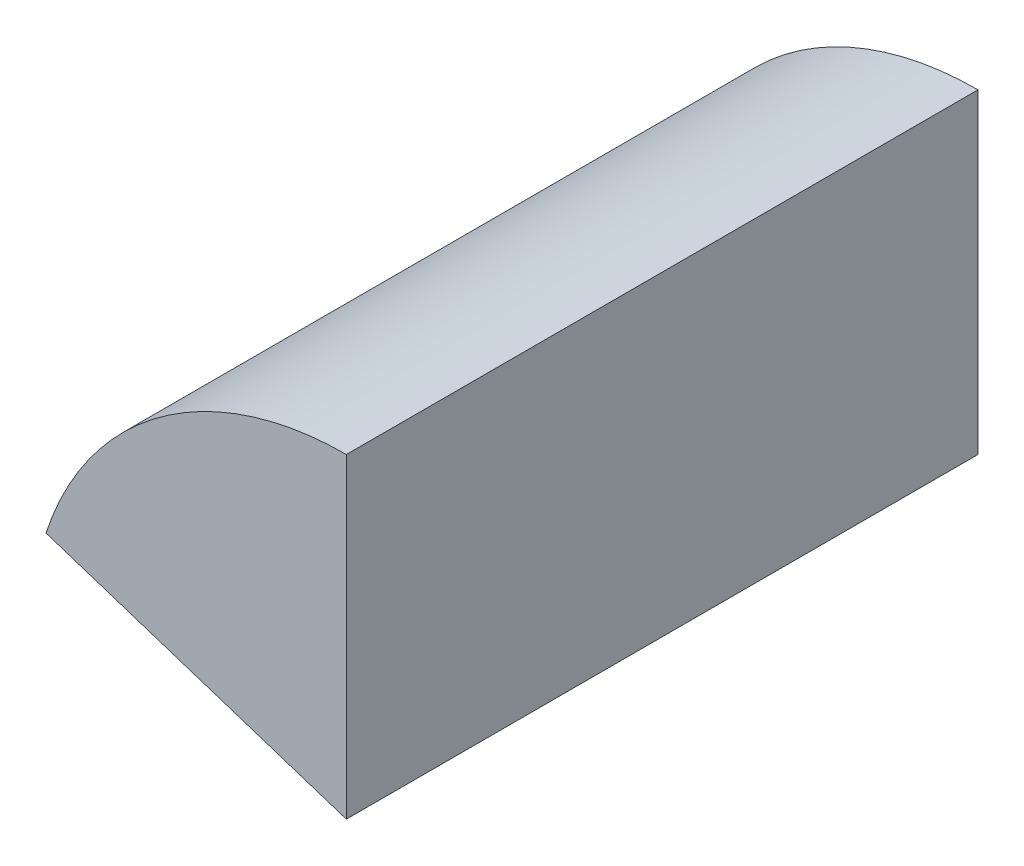
ISO-10303-21;
HEADER;
FILE_DESCRIPTION(('STEP AP214'),'2;1');
FILE_NAME('part.step','',(''),(''),'','','');
FILE_SCHEMA(('AUTOMOTIVE_DESIGN { 1 0 10303 214 1 1 1 1 }'));
ENDSEC;
DATA;
#1=APPLICATION_CONTEXT('core data for automotive mechanical design processes');
#2=APPLICATION_PROTOCOL_DEFINITION('international standard','automotive_design',2000,#1);
#3=PRODUCT_CONTEXT('',#1,'mechanical');
#4=PRODUCT('Part','Part','',(#3));
#5=PRODUCT_RELATED_PRODUCT_CATEGORY('part','',(#4));
#6=PRODUCT_DEFINITION_FORMATION('','',#4);
#7=PRODUCT_DEFINITION_CONTEXT('part definition',#1,'design');
#8=PRODUCT_DEFINITION('design','',#6,#7);
#9=PRODUCT_DEFINITION_SHAPE('','',#8);
#10=(LENGTH_UNIT() NAMED_UNIT(*) SI_UNIT(.MILLI.,.METRE.));
#11=(NAMED_UNIT(*) PLANE_ANGLE_UNIT() SI_UNIT($,.RADIAN.));
#12=(NAMED_UNIT(*) SI_UNIT($,.STERADIAN.) SOLID_ANGLE_UNIT());
#13=UNCERTAINTY_MEASURE_WITH_UNIT(LENGTH_MEASURE(1.E-05),#10,'distance_accuracy_value','');
#14=(GEOMETRIC_REPRESENTATION_CONTEXT(3) GLOBAL_UNCERTAINTY_ASSIGNED_CONTEXT((#13)) GLOBAL_UNIT_ASSIGNED_CONTEXT((#10,
#11,#12)) REPRESENTATION_CONTEXT('',''));
#15=CARTESIAN_POINT('',(0.,0.,0.));
#16=DIRECTION('',(0.,0.,1.));
#17=DIRECTION('',(1.,0.,0.));
#18=AXIS2_PLACEMENT_3D('',#15,#16,#17);
#19=CARTESIAN_POINT('',(0.,0.,50.));
#20=DIRECTION('',(0.309016994374951,0.951056516295152,0.));
#21=DIRECTION('',(-0.951056516295152,0.309016994374951,0.));
#22=AXIS2_PLACEMENT_3D('',#19,#20,#21);
#23=PLANE('',#22);
#24=DIRECTION('',(0.951056516295152,-0.309016994374951,0.));
#25=VECTOR('',#24,1.);
#26=CARTESIAN_POINT('',(0.,0.,0.));
#27=LINE('',#26,#25);
#28=CARTESIAN_POINT('',(-23.7764129073788,7.72542485937378,0.));
#29=VERTEX_POINT('',#28);
#30=CARTESIAN_POINT('',(0.,0.,0.));
#31=VERTEX_POINT('',#30);
#32=EDGE_CURVE('E80',#29,#31,#27,.T.);
#33=ORIENTED_EDGE('',*,*,#32,.T.);
#34=DIRECTION('',(0.,0.,-1.));
#35=VECTOR('',#34,1.);
#36=CARTESIAN_POINT('',(0.,0.,50.));
#37=LINE('',#36,#35);
#38=CARTESIAN_POINT('',(0.,0.,50.));
#39=VERTEX_POINT('',#38);
#40=EDGE_CURVE('E11',#39,#31,#37,.T.);
#41=ORIENTED_EDGE('',*,*,#40,.F.);
#42=DIRECTION('',(0.951056516295152,-0.309016994374951,0.));
#43=VECTOR('',#42,1.);
#44=CARTESIAN_POINT('',(0.,0.,50.));
#45=LINE('',#44,#43);
#46=CARTESIAN_POINT('',(-23.7764129073788,7.72542485937378,50.));
#47=VERTEX_POINT('',#46);
#48=EDGE_CURVE('E73',#47,#39,#45,.T.);
#49=ORIENTED_EDGE('',*,*,#48,.F.);
#50=DIRECTION('',(0.,0.,-1.));
#51=VECTOR('',#50,1.);
#52=CARTESIAN_POINT('',(-23.7764129073788,7.72542485937378,50.));
#53=LINE('',#52,#51);
#54=EDGE_CURVE('E81',#47,#29,#53,.T.);
#55=ORIENTED_EDGE('',*,*,#54,.T.);
#56=EDGE_LOOP('',(#33,#41,#49,#55));
#57=FACE_BOUND('',#56,.T.);
#58=ADVANCED_FACE('F33',(#57),#23,.F.);
#59=CARTESIAN_POINT('',(0.,25.,50.));
#60=DIRECTION('',(-1.,0.,0.));
#61=DIRECTION('',(0.,0.,1.));
#62=AXIS2_PLACEMENT_3D('',#59,#60,#61);
#63=PLANE('',#62);
#64=DIRECTION('',(0.,1.,0.));
#65=VECTOR('',#64,1.);
#66=CARTESIAN_POINT('',(0.,25.,0.));
#67=LINE('',#66,#65);
#68=CARTESIAN_POINT('',(0.,25.,0.));
#69=VERTEX_POINT('',#68);
#70=EDGE_CURVE('E61',#31,#69,#67,.T.);
#71=ORIENTED_EDGE('',*,*,#70,.T.);
#72=DIRECTION('',(0.,0.,-1.));
#73=VECTOR('',#72,1.);
#74=CARTESIAN_POINT('',(0.,25.,50.));
#75=LINE('',#74,#73);
#76=CARTESIAN_POINT('',(0.,25.,50.));
#77=VERTEX_POINT('',#76);
#78=EDGE_CURVE('E41',#77,#69,#75,.T.);
#79=ORIENTED_EDGE('',*,*,#78,.F.);
#80=DIRECTION('',(0.,1.,0.));
#81=VECTOR('',#80,1.);
#82=CARTESIAN_POINT('',(0.,25.,50.));
#83=LINE('',#82,#81);
#84=EDGE_CURVE('E69',#39,#77,#83,.T.);
#85=ORIENTED_EDGE('',*,*,#84,.F.);
#86=ORIENTED_EDGE('',*,*,#40,.T.);
#87=EDGE_LOOP('',(#71,#79,#85,#86));
#88=FACE_BOUND('',#87,.T.);
#89=ADVANCED_FACE('F70',(#88),#63,.F.);
#90=CARTESIAN_POINT('',(0.,0.,50.));
#91=DIRECTION('',(0.,0.,-1.));
#92=DIRECTION('',(-1.,0.,0.));
#93=AXIS2_PLACEMENT_3D('',#90,#91,#92);
#94=CYLINDRICAL_SURFACE('',#93,25.);
#95=CARTESIAN_POINT('',(0.,0.,0.));
#96=DIRECTION('',(0.,0.,1.));
#97=DIRECTION('',(1.,0.,0.));
#98=AXIS2_PLACEMENT_3D('',#95,#96,#97);
#99=CIRCLE('',#98,25.);
#100=EDGE_CURVE('E66',#69,#29,#99,.T.);
#101=ORIENTED_EDGE('',*,*,#100,.T.);
#102=ORIENTED_EDGE('',*,*,#54,.F.);
#103=CARTESIAN_POINT('',(0.,0.,50.));
#104=DIRECTION('',(0.,0.,1.));
#105=DIRECTION('',(1.,0.,0.));
#106=AXIS2_PLACEMENT_3D('',#103,#104,#105);
#107=CIRCLE('',#106,25.);
#108=EDGE_CURVE('E49',#77,#47,#107,.T.);
#109=ORIENTED_EDGE('',*,*,#108,.F.);
#110=ORIENTED_EDGE('',*,*,#78,.T.);
#111=EDGE_LOOP('',(#101,#102,#109,#110));
#112=FACE_BOUND('',#111,.T.);
#113=ADVANCED_FACE('F92',(#112),#94,.T.);
#114=CARTESIAN_POINT('',(0.,0.,50.));
#115=DIRECTION('',(0.,0.,1.));
#116=DIRECTION('',(1.,0.,0.));
#117=AXIS2_PLACEMENT_3D('',#114,#115,#116);
#118=PLANE('',#117);
#119=ORIENTED_EDGE('',*,*,#48,.T.);
#120=ORIENTED_EDGE('',*,*,#84,.T.);
#121=ORIENTED_EDGE('',*,*,#108,.T.);
#122=EDGE_LOOP('',(#119,#120,#121));
#123=FACE_BOUND('',#122,.T.);
#124=ADVANCED_FACE('F76',(#123),#118,.T.);
#125=CARTESIAN_POINT('',(0.,0.,0.));
#126=DIRECTION('',(0.,0.,1.));
#127=DIRECTION('',(1.,0.,0.));
#128=AXIS2_PLACEMENT_3D('',#125,#126,#127);
#129=PLANE('',#128);
#130=CARTESIAN_POINT('',(-9.03515975644759,12.4809796886852,0.));
#131=DIRECTION('',(0.,0.,-1.));
#132=DIRECTION('',(-1.,0.,0.));
#133=AXIS2_PLACEMENT_3D('',#130,#131,#132);
#134=CIRCLE('',#133,5.);
#135=CARTESIAN_POINT('',(-14.0351597564476,12.4809796886852,0.));
#136=VERTEX_POINT('',#135);
#137=EDGE_CURVE('E87',#136,#136,#134,.T.);
#138=ORIENTED_EDGE('',*,*,#137,.F.);
#139=EDGE_LOOP('',(#138));
#140=FACE_BOUND('',#139,.T.);
#141=ORIENTED_EDGE('',*,*,#32,.F.);
#142=ORIENTED_EDGE('',*,*,#100,.F.);
#143=ORIENTED_EDGE('',*,*,#70,.F.);
#144=EDGE_LOOP('',(#141,#142,#143));
#145=FACE_BOUND('',#144,.T.);
#146=ADVANCED_FACE('F93',(#140,#145),#129,.F.);
#147=CARTESIAN_POINT('',(-9.03515975644759,12.4809796886852,10.));
#148=DIRECTION('',(0.,0.,-1.));
#149=DIRECTION('',(-1.,0.,0.));
#150=AXIS2_PLACEMENT_3D('',#147,#148,#149);
#151=CYLINDRICAL_SURFACE('',#150,5.);
#152=CARTESIAN_POINT('',(-9.03515975644759,12.4809796886852,10.));
#153=DIRECTION('',(0.,0.,-1.));
#154=DIRECTION('',(-1.,0.,0.));
#155=AXIS2_PLACEMENT_3D('',#152,#153,#154);
#156=CIRCLE('',#155,5.);
#157=CARTESIAN_POINT('',(-14.0351597564476,12.4809796886852,10.));
#158=VERTEX_POINT('',#157);
#159=EDGE_CURVE('E83',#158,#158,#156,.T.);
#160=ORIENTED_EDGE('',*,*,#159,.F.);
#161=EDGE_LOOP('',(#160));
#162=FACE_BOUND('',#161,.T.);
#163=ORIENTED_EDGE('',*,*,#137,.T.);
#164=EDGE_LOOP('',(#163));
#165=FACE_BOUND('',#164,.T.);
#166=ADVANCED_FACE('F95',(#162,#165),#151,.F.);
#167=CARTESIAN_POINT('',(-9.03515975644759,12.4809796886852,10.));
#168=DIRECTION('',(0.,0.,-1.));
#169=DIRECTION('',(-1.,0.,0.));
#170=AXIS2_PLACEMENT_3D('',#167,#168,#169);
#171=PLANE('',#170);
#172=ORIENTED_EDGE('',*,*,#159,.T.);
#173=EDGE_LOOP('',(#172));
#174=FACE_BOUND('',#173,.T.);
#175=ADVANCED_FACE('F102',(#174),#171,.T.);
#176=CLOSED_SHELL('',(#58,#89,#113,#124,#146,#166,#175));
#177=MANIFOLD_SOLID_BREP('B2',#176);
#178=ADVANCED_BREP_SHAPE_REPRESENTATION('',(#18,#177),#14);
#179=SHAPE_DEFINITION_REPRESENTATION(#9,#178);
ENDSEC;
END-ISO-10303-21;
